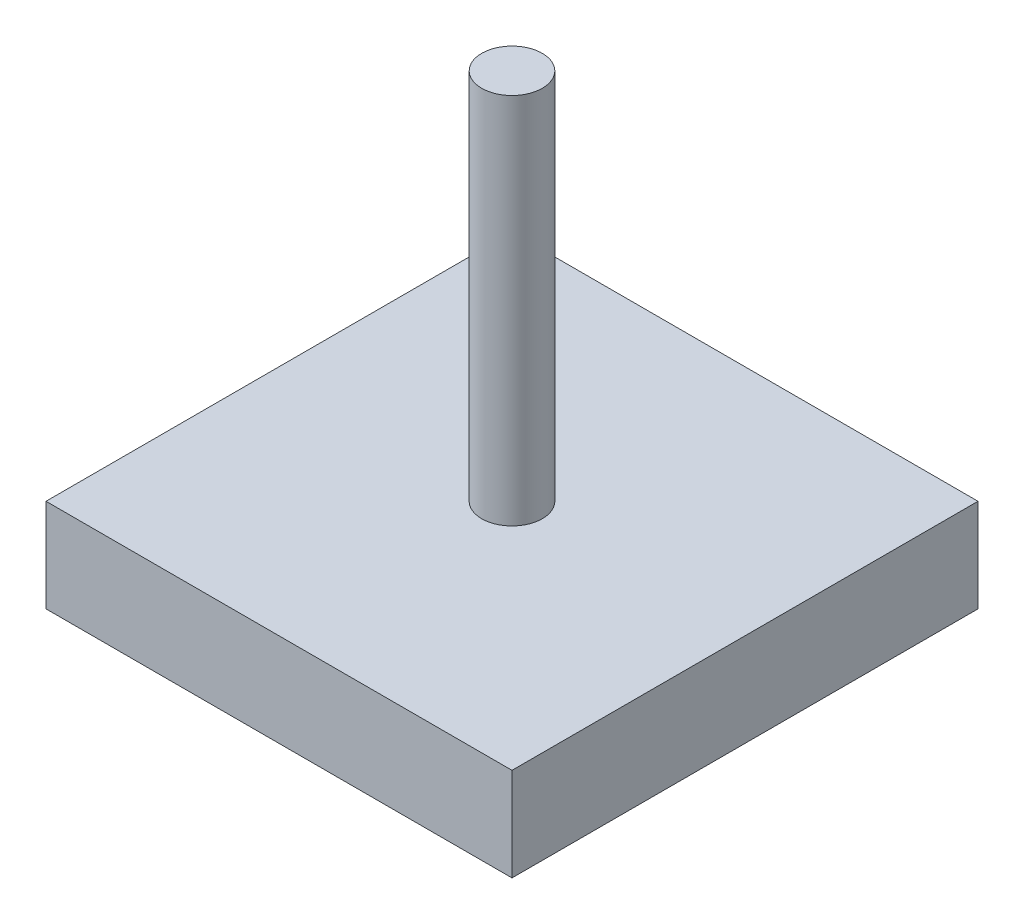
ISO-10303-21;
HEADER;
FILE_DESCRIPTION(('STEP AP214'),'2;1');
FILE_NAME('part.step','',(''),(''),'','','');
FILE_SCHEMA(('AUTOMOTIVE_DESIGN { 1 0 10303 214 1 1 1 1 }'));
ENDSEC;
DATA;
#1=APPLICATION_CONTEXT('core data for automotive mechanical design processes');
#2=APPLICATION_PROTOCOL_DEFINITION('international standard','automotive_design',2000,#1);
#3=PRODUCT_CONTEXT('',#1,'mechanical');
#4=PRODUCT('Part','Part','',(#3));
#5=PRODUCT_RELATED_PRODUCT_CATEGORY('part','',(#4));
#6=PRODUCT_DEFINITION_FORMATION('','',#4);
#7=PRODUCT_DEFINITION_CONTEXT('part definition',#1,'design');
#8=PRODUCT_DEFINITION('design','',#6,#7);
#9=PRODUCT_DEFINITION_SHAPE('','',#8);
#10=(LENGTH_UNIT() NAMED_UNIT(*) SI_UNIT(.MILLI.,.METRE.));
#11=(NAMED_UNIT(*) PLANE_ANGLE_UNIT() SI_UNIT($,.RADIAN.));
#12=(NAMED_UNIT(*) SI_UNIT($,.STERADIAN.) SOLID_ANGLE_UNIT());
#13=UNCERTAINTY_MEASURE_WITH_UNIT(LENGTH_MEASURE(1.E-05),#10,'distance_accuracy_value','');
#14=(GEOMETRIC_REPRESENTATION_CONTEXT(3) GLOBAL_UNCERTAINTY_ASSIGNED_CONTEXT((#13)) GLOBAL_UNIT_ASSIGNED_CONTEXT((#10,
#11,#12)) REPRESENTATION_CONTEXT('',''));
#15=CARTESIAN_POINT('',(0.,0.,0.));
#16=DIRECTION('',(0.,0.,1.));
#17=DIRECTION('',(1.,0.,0.));
#18=AXIS2_PLACEMENT_3D('',#15,#16,#17);
#19=CARTESIAN_POINT('',(-25.,50.,-25.));
#20=DIRECTION('',(0.,-1.,0.));
#21=DIRECTION('',(0.,0.,-1.));
#22=AXIS2_PLACEMENT_3D('',#19,#20,#21);
#23=CYLINDRICAL_SURFACE('',#22,3.25);
#24=CARTESIAN_POINT('',(-25.,10.,-25.));
#25=DIRECTION('',(0.,1.,0.));
#26=DIRECTION('',(0.,0.,1.));
#27=AXIS2_PLACEMENT_3D('',#24,#25,#26);
#28=CIRCLE('',#27,3.25);
#29=CARTESIAN_POINT('',(-25.,10.,-21.75));
#30=VERTEX_POINT('',#29);
#31=EDGE_CURVE('E115',#30,#30,#28,.T.);
#32=ORIENTED_EDGE('',*,*,#31,.T.);
#33=EDGE_LOOP('',(#32));
#34=FACE_BOUND('',#33,.T.);
#35=CARTESIAN_POINT('',(-25.,50.,-25.));
#36=DIRECTION('',(0.,1.,0.));
#37=DIRECTION('',(0.,0.,1.));
#38=AXIS2_PLACEMENT_3D('',#35,#36,#37);
#39=CIRCLE('',#38,3.25);
#40=CARTESIAN_POINT('',(-25.,50.,-21.75));
#41=VERTEX_POINT('',#40);
#42=EDGE_CURVE('E11',#41,#41,#39,.T.);
#43=ORIENTED_EDGE('',*,*,#42,.F.);
#44=EDGE_LOOP('',(#43));
#45=FACE_BOUND('',#44,.T.);
#46=ADVANCED_FACE('F39',(#34,#45),#23,.T.);
#47=CARTESIAN_POINT('',(-25.,50.,-25.));
#48=DIRECTION('',(0.,1.,0.));
#49=DIRECTION('',(0.,0.,1.));
#50=AXIS2_PLACEMENT_3D('',#47,#48,#49);
#51=PLANE('',#50);
#52=ORIENTED_EDGE('',*,*,#42,.T.);
#53=EDGE_LOOP('',(#52));
#54=FACE_BOUND('',#53,.T.);
#55=ADVANCED_FACE('F139',(#54),#51,.T.);
#56=CARTESIAN_POINT('',(0.,10.,0.));
#57=DIRECTION('',(0.,1.,0.));
#58=DIRECTION('',(0.,0.,1.));
#59=AXIS2_PLACEMENT_3D('',#56,#57,#58);
#60=PLANE('',#59);
#61=DIRECTION('',(0.,0.,-1.));
#62=VECTOR('',#61,1.);
#63=CARTESIAN_POINT('',(0.,10.,0.));
#64=LINE('',#63,#62);
#65=CARTESIAN_POINT('',(0.,10.,0.));
#66=VERTEX_POINT('',#65);
#67=CARTESIAN_POINT('',(0.,10.,-50.));
#68=VERTEX_POINT('',#67);
#69=EDGE_CURVE('E93',#66,#68,#64,.T.);
#70=ORIENTED_EDGE('',*,*,#69,.T.);
#71=DIRECTION('',(-1.,0.,0.));
#72=VECTOR('',#71,1.);
#73=CARTESIAN_POINT('',(0.,10.,-50.));
#74=LINE('',#73,#72);
#75=CARTESIAN_POINT('',(-50.,10.,-50.));
#76=VERTEX_POINT('',#75);
#77=EDGE_CURVE('E87',#68,#76,#74,.T.);
#78=ORIENTED_EDGE('',*,*,#77,.T.);
#79=DIRECTION('',(0.,0.,1.));
#80=VECTOR('',#79,1.);
#81=CARTESIAN_POINT('',(-50.,10.,0.));
#82=LINE('',#81,#80);
#83=CARTESIAN_POINT('',(-50.,10.,0.));
#84=VERTEX_POINT('',#83);
#85=EDGE_CURVE('E91',#76,#84,#82,.T.);
#86=ORIENTED_EDGE('',*,*,#85,.T.);
#87=DIRECTION('',(1.,0.,0.));
#88=VECTOR('',#87,1.);
#89=CARTESIAN_POINT('',(0.,10.,0.));
#90=LINE('',#89,#88);
#91=EDGE_CURVE('E56',#84,#66,#90,.T.);
#92=ORIENTED_EDGE('',*,*,#91,.T.);
#93=EDGE_LOOP('',(#70,#78,#86,#92));
#94=FACE_BOUND('',#93,.T.);
#95=ORIENTED_EDGE('',*,*,#31,.F.);
#96=EDGE_LOOP('',(#95));
#97=FACE_BOUND('',#96,.T.);
#98=ADVANCED_FACE('F88',(#94,#97),#60,.T.);
#99=CARTESIAN_POINT('',(0.,10.,0.));
#100=DIRECTION('',(-1.,0.,0.));
#101=DIRECTION('',(0.,0.,1.));
#102=AXIS2_PLACEMENT_3D('',#99,#100,#101);
#103=PLANE('',#102);
#104=DIRECTION('',(0.,0.,-1.));
#105=VECTOR('',#104,1.);
#106=CARTESIAN_POINT('',(0.,0.,0.));
#107=LINE('',#106,#105);
#108=CARTESIAN_POINT('',(0.,0.,0.));
#109=VERTEX_POINT('',#108);
#110=CARTESIAN_POINT('',(0.,0.,-50.));
#111=VERTEX_POINT('',#110);
#112=EDGE_CURVE('E111',#109,#111,#107,.T.);
#113=ORIENTED_EDGE('',*,*,#112,.T.);
#114=DIRECTION('',(0.,-1.,0.));
#115=VECTOR('',#114,1.);
#116=CARTESIAN_POINT('',(0.,10.,-50.));
#117=LINE('',#116,#115);
#118=EDGE_CURVE('E48',#68,#111,#117,.T.);
#119=ORIENTED_EDGE('',*,*,#118,.F.);
#120=ORIENTED_EDGE('',*,*,#69,.F.);
#121=DIRECTION('',(0.,-1.,0.));
#122=VECTOR('',#121,1.);
#123=CARTESIAN_POINT('',(0.,10.,0.));
#124=LINE('',#123,#122);
#125=EDGE_CURVE('E107',#66,#109,#124,.T.);
#126=ORIENTED_EDGE('',*,*,#125,.T.);
#127=EDGE_LOOP('',(#113,#119,#120,#126));
#128=FACE_BOUND('',#127,.T.);
#129=ADVANCED_FACE('F128',(#128),#103,.F.);
#130=CARTESIAN_POINT('',(0.,10.,-50.));
#131=DIRECTION('',(0.,0.,1.));
#132=DIRECTION('',(1.,0.,0.));
#133=AXIS2_PLACEMENT_3D('',#130,#131,#132);
#134=PLANE('',#133);
#135=DIRECTION('',(-1.,0.,0.));
#136=VECTOR('',#135,1.);
#137=CARTESIAN_POINT('',(0.,0.,-50.));
#138=LINE('',#137,#136);
#139=CARTESIAN_POINT('',(-50.,0.,-50.));
#140=VERTEX_POINT('',#139);
#141=EDGE_CURVE('E99',#111,#140,#138,.T.);
#142=ORIENTED_EDGE('',*,*,#141,.T.);
#143=DIRECTION('',(0.,-1.,0.));
#144=VECTOR('',#143,1.);
#145=CARTESIAN_POINT('',(-50.,10.,-50.));
#146=LINE('',#145,#144);
#147=EDGE_CURVE('E97',#76,#140,#146,.T.);
#148=ORIENTED_EDGE('',*,*,#147,.F.);
#149=ORIENTED_EDGE('',*,*,#77,.F.);
#150=ORIENTED_EDGE('',*,*,#118,.T.);
#151=EDGE_LOOP('',(#142,#148,#149,#150));
#152=FACE_BOUND('',#151,.T.);
#153=ADVANCED_FACE('F98',(#152),#134,.F.);
#154=CARTESIAN_POINT('',(-50.,10.,0.));
#155=DIRECTION('',(1.,0.,0.));
#156=DIRECTION('',(0.,0.,-1.));
#157=AXIS2_PLACEMENT_3D('',#154,#155,#156);
#158=PLANE('',#157);
#159=DIRECTION('',(0.,0.,1.));
#160=VECTOR('',#159,1.);
#161=CARTESIAN_POINT('',(-50.,0.,0.));
#162=LINE('',#161,#160);
#163=CARTESIAN_POINT('',(-50.,0.,0.));
#164=VERTEX_POINT('',#163);
#165=EDGE_CURVE('E73',#140,#164,#162,.T.);
#166=ORIENTED_EDGE('',*,*,#165,.T.);
#167=DIRECTION('',(0.,-1.,0.));
#168=VECTOR('',#167,1.);
#169=CARTESIAN_POINT('',(-50.,10.,0.));
#170=LINE('',#169,#168);
#171=EDGE_CURVE('E101',#84,#164,#170,.T.);
#172=ORIENTED_EDGE('',*,*,#171,.F.);
#173=ORIENTED_EDGE('',*,*,#85,.F.);
#174=ORIENTED_EDGE('',*,*,#147,.T.);
#175=EDGE_LOOP('',(#166,#172,#173,#174));
#176=FACE_BOUND('',#175,.T.);
#177=ADVANCED_FACE('F103',(#176),#158,.F.);
#178=CARTESIAN_POINT('',(0.,10.,0.));
#179=DIRECTION('',(0.,0.,-1.));
#180=DIRECTION('',(-1.,0.,0.));
#181=AXIS2_PLACEMENT_3D('',#178,#179,#180);
#182=PLANE('',#181);
#183=DIRECTION('',(1.,0.,0.));
#184=VECTOR('',#183,1.);
#185=CARTESIAN_POINT('',(0.,0.,0.));
#186=LINE('',#185,#184);
#187=EDGE_CURVE('E79',#164,#109,#186,.T.);
#188=ORIENTED_EDGE('',*,*,#187,.T.);
#189=ORIENTED_EDGE('',*,*,#125,.F.);
#190=ORIENTED_EDGE('',*,*,#91,.F.);
#191=ORIENTED_EDGE('',*,*,#171,.T.);
#192=EDGE_LOOP('',(#188,#189,#190,#191));
#193=FACE_BOUND('',#192,.T.);
#194=ADVANCED_FACE('F132',(#193),#182,.F.);
#195=CARTESIAN_POINT('',(-25.,0.,-25.));
#196=DIRECTION('',(0.,1.,0.));
#197=DIRECTION('',(0.,0.,1.));
#198=AXIS2_PLACEMENT_3D('',#195,#196,#197);
#199=PLANE('',#198);
#200=ORIENTED_EDGE('',*,*,#112,.F.);
#201=ORIENTED_EDGE('',*,*,#187,.F.);
#202=ORIENTED_EDGE('',*,*,#165,.F.);
#203=ORIENTED_EDGE('',*,*,#141,.F.);
#204=EDGE_LOOP('',(#200,#201,#202,#203));
#205=FACE_BOUND('',#204,.T.);
#206=ADVANCED_FACE('F130',(#205),#199,.F.);
#207=CLOSED_SHELL('',(#46,#55,#98,#129,#153,#177,#194,#206));
#208=MANIFOLD_SOLID_BREP('B2',#207);
#209=ADVANCED_BREP_SHAPE_REPRESENTATION('',(#18,#208),#14);
#210=SHAPE_DEFINITION_REPRESENTATION(#9,#209);
ENDSEC;
END-ISO-10303-21;
